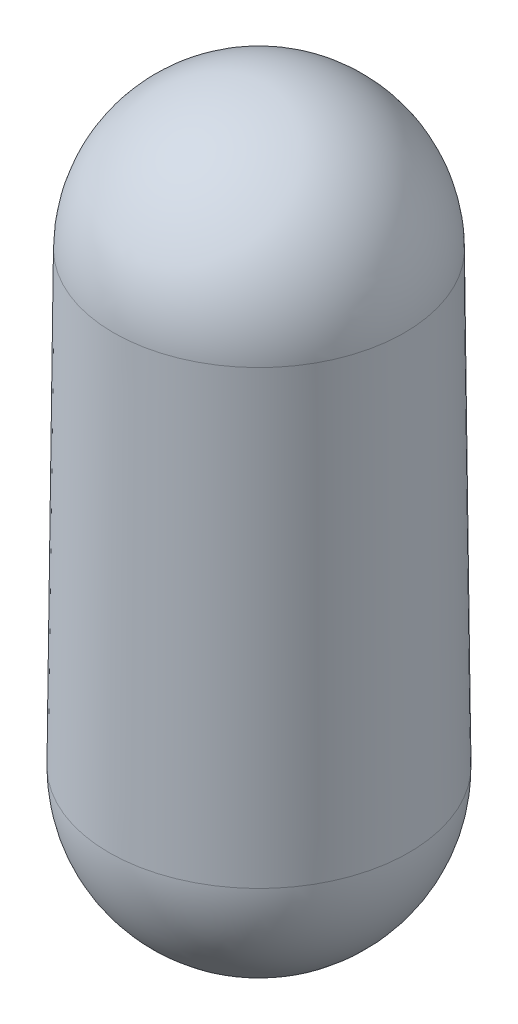
ISO-10303-21;
HEADER;
FILE_DESCRIPTION(('STEP AP214'),'2;1');
FILE_NAME('part.step','',(''),(''),'','','');
FILE_SCHEMA(('AUTOMOTIVE_DESIGN { 1 0 10303 214 1 1 1 1 }'));
ENDSEC;
DATA;
#1=APPLICATION_CONTEXT('core data for automotive mechanical design processes');
#2=APPLICATION_PROTOCOL_DEFINITION('international standard','automotive_design',2000,#1);
#3=PRODUCT_CONTEXT('',#1,'mechanical');
#4=PRODUCT('Part','Part','',(#3));
#5=PRODUCT_RELATED_PRODUCT_CATEGORY('part','',(#4));
#6=PRODUCT_DEFINITION_FORMATION('','',#4);
#7=PRODUCT_DEFINITION_CONTEXT('part definition',#1,'design');
#8=PRODUCT_DEFINITION('design','',#6,#7);
#9=PRODUCT_DEFINITION_SHAPE('','',#8);
#10=(LENGTH_UNIT() NAMED_UNIT(*) SI_UNIT(.MILLI.,.METRE.));
#11=(NAMED_UNIT(*) PLANE_ANGLE_UNIT() SI_UNIT($,.RADIAN.));
#12=(NAMED_UNIT(*) SI_UNIT($,.STERADIAN.) SOLID_ANGLE_UNIT());
#13=UNCERTAINTY_MEASURE_WITH_UNIT(LENGTH_MEASURE(1.E-05),#10,'distance_accuracy_value','');
#14=(GEOMETRIC_REPRESENTATION_CONTEXT(3) GLOBAL_UNCERTAINTY_ASSIGNED_CONTEXT((#13)) GLOBAL_UNIT_ASSIGNED_CONTEXT((#10,
#11,#12)) REPRESENTATION_CONTEXT('',''));
#15=CARTESIAN_POINT('',(0.,0.,0.));
#16=DIRECTION('',(0.,0.,1.));
#17=DIRECTION('',(1.,0.,0.));
#18=AXIS2_PLACEMENT_3D('',#15,#16,#17);
#19=CARTESIAN_POINT('',(0.,-2492.17747502716,0.));
#20=DIRECTION('',(0.,1.,0.));
#21=DIRECTION('',(1.,0.,0.));
#22=AXIS2_PLACEMENT_3D('',#19,#20,#21);
#23=CYLINDRICAL_SURFACE('',#22,38.989);
#24=CARTESIAN_POINT('',(0.,-2461.95147502716,0.));
#25=DIRECTION('',(0.,1.,0.));
#26=DIRECTION('',(1.,0.,0.));
#27=AXIS2_PLACEMENT_3D('',#24,#25,#26);
#28=CIRCLE('',#27,38.989);
#29=CARTESIAN_POINT('',(38.989,-2461.95147502716,0.));
#30=VERTEX_POINT('',#29);
#31=EDGE_CURVE('E164',#30,#30,#28,.T.);
#32=ORIENTED_EDGE('',*,*,#31,.T.);
#33=EDGE_LOOP('',(#32));
#34=FACE_BOUND('',#33,.T.);
#35=CARTESIAN_POINT('',(0.,-2471.60347502716,0.));
#36=DIRECTION('',(0.,-1.,0.));
#37=DIRECTION('',(-1.,0.,0.));
#38=AXIS2_PLACEMENT_3D('',#35,#36,#37);
#39=CIRCLE('',#38,38.989);
#40=CARTESIAN_POINT('',(-38.989,-2471.60347502716,0.));
#41=VERTEX_POINT('',#40);
#42=EDGE_CURVE('E51',#41,#41,#39,.F.);
#43=ORIENTED_EDGE('',*,*,#42,.F.);
#44=EDGE_LOOP('',(#43));
#45=FACE_BOUND('',#44,.T.);
#46=ADVANCED_FACE('F47',(#34,#45),#23,.F.);
#47=CARTESIAN_POINT('',(0.,-2492.17747502716,0.));
#48=DIRECTION('',(0.,1.,0.));
#49=DIRECTION('',(1.,0.,0.));
#50=AXIS2_PLACEMENT_3D('',#47,#48,#49);
#51=CYLINDRICAL_SURFACE('',#50,54.102);
#52=CARTESIAN_POINT('',(0.,-2463.53897502716,0.));
#53=DIRECTION('',(0.,1.,0.));
#54=DIRECTION('',(1.,0.,0.));
#55=AXIS2_PLACEMENT_3D('',#52,#53,#54);
#56=CIRCLE('',#55,54.102);
#57=CARTESIAN_POINT('',(54.102,-2463.53897502716,0.));
#58=VERTEX_POINT('',#57);
#59=EDGE_CURVE('E11',#58,#58,#56,.F.);
#60=ORIENTED_EDGE('',*,*,#59,.F.);
#61=EDGE_LOOP('',(#60));
#62=FACE_BOUND('',#61,.T.);
#63=CARTESIAN_POINT('',(0.,-2461.95147502716,0.));
#64=DIRECTION('',(0.,1.,0.));
#65=DIRECTION('',(1.,0.,0.));
#66=AXIS2_PLACEMENT_3D('',#63,#64,#65);
#67=CIRCLE('',#66,54.102);
#68=CARTESIAN_POINT('',(54.102,-2461.95147502716,0.));
#69=VERTEX_POINT('',#68);
#70=EDGE_CURVE('E60',#69,#69,#67,.T.);
#71=ORIENTED_EDGE('',*,*,#70,.F.);
#72=EDGE_LOOP('',(#71));
#73=FACE_BOUND('',#72,.T.);
#74=ADVANCED_FACE('F49',(#62,#73),#51,.T.);
#75=CARTESIAN_POINT('',(0.,-2461.95147502716,0.));
#76=DIRECTION('',(0.,1.,0.));
#77=DIRECTION('',(1.,0.,0.));
#78=AXIS2_PLACEMENT_3D('',#75,#76,#77);
#79=PLANE('',#78);
#80=ORIENTED_EDGE('',*,*,#31,.F.);
#81=EDGE_LOOP('',(#80));
#82=FACE_BOUND('',#81,.T.);
#83=ORIENTED_EDGE('',*,*,#70,.T.);
#84=EDGE_LOOP('',(#83));
#85=FACE_BOUND('',#84,.T.);
#86=ADVANCED_FACE('F105',(#82,#85),#79,.T.);
#87=CARTESIAN_POINT('',(0.,-2755.23515865923,0.));
#88=DIRECTION('',(0.,1.,0.));
#89=DIRECTION('',(1.,0.,0.));
#90=AXIS2_PLACEMENT_3D('',#87,#88,#89);
#91=CYLINDRICAL_SURFACE('',#90,95.25);
#92=CARTESIAN_POINT('',(0.,-2485.82747502716,0.));
#93=DIRECTION('',(0.,1.,0.));
#94=DIRECTION('',(1.,0.,0.));
#95=AXIS2_PLACEMENT_3D('',#92,#93,#94);
#96=CIRCLE('',#95,95.25);
#97=CARTESIAN_POINT('',(95.25,-2485.82747502716,0.));
#98=VERTEX_POINT('',#97);
#99=EDGE_CURVE('E72',#98,#98,#96,.F.);
#100=ORIENTED_EDGE('',*,*,#99,.F.);
#101=EDGE_LOOP('',(#100));
#102=FACE_BOUND('',#101,.T.);
#103=CARTESIAN_POINT('',(0.,-2463.53897502716,0.));
#104=DIRECTION('',(0.,1.,0.));
#105=DIRECTION('',(1.,0.,0.));
#106=AXIS2_PLACEMENT_3D('',#103,#104,#105);
#107=CIRCLE('',#106,95.25);
#108=CARTESIAN_POINT('',(95.25,-2463.53897502716,0.));
#109=VERTEX_POINT('',#108);
#110=EDGE_CURVE('E67',#109,#109,#107,.T.);
#111=ORIENTED_EDGE('',*,*,#110,.F.);
#112=EDGE_LOOP('',(#111));
#113=FACE_BOUND('',#112,.T.);
#114=ADVANCED_FACE('F102',(#102,#113),#91,.T.);
#115=CARTESIAN_POINT('',(0.,-2463.53897502716,0.));
#116=DIRECTION('',(0.,1.,0.));
#117=DIRECTION('',(1.,0.,0.));
#118=AXIS2_PLACEMENT_3D('',#115,#116,#117);
#119=PLANE('',#118);
#120=CARTESIAN_POINT('',(53.8815367264154,-2463.53897502716,53.8815367264145));
#121=DIRECTION('',(0.,1.,0.));
#122=DIRECTION('',(0.,0.,1.));
#123=AXIS2_PLACEMENT_3D('',#120,#121,#122);
#124=CIRCLE('',#123,9.52499999999999);
#125=CARTESIAN_POINT('',(53.8815367264155,-2463.53897502716,63.4065367264145));
#126=VERTEX_POINT('',#125);
#127=EDGE_CURVE('E165',#126,#126,#124,.T.);
#128=ORIENTED_EDGE('',*,*,#127,.F.);
#129=EDGE_LOOP('',(#128));
#130=FACE_BOUND('',#129,.T.);
#131=CARTESIAN_POINT('',(-53.8815367264146,-2463.53897502716,53.8815367264152));
#132=DIRECTION('',(0.,1.,0.));
#133=DIRECTION('',(-1.,0.,0.));
#134=AXIS2_PLACEMENT_3D('',#131,#132,#133);
#135=CIRCLE('',#134,9.52499999999999);
#136=CARTESIAN_POINT('',(-63.4065367264146,-2463.53897502716,53.8815367264152));
#137=VERTEX_POINT('',#136);
#138=EDGE_CURVE('E178',#137,#137,#135,.T.);
#139=ORIENTED_EDGE('',*,*,#138,.F.);
#140=EDGE_LOOP('',(#139));
#141=FACE_BOUND('',#140,.T.);
#142=CARTESIAN_POINT('',(-53.881536726415,-2463.53897502716,-53.8815367264147));
#143=DIRECTION('',(0.,1.,0.));
#144=DIRECTION('',(0.,0.,-1.));
#145=AXIS2_PLACEMENT_3D('',#142,#143,#144);
#146=CIRCLE('',#145,9.52499999999999);
#147=CARTESIAN_POINT('',(-53.8815367264151,-2463.53897502716,-63.4065367264147));
#148=VERTEX_POINT('',#147);
#149=EDGE_CURVE('E80',#148,#148,#146,.T.);
#150=ORIENTED_EDGE('',*,*,#149,.F.);
#151=EDGE_LOOP('',(#150));
#152=FACE_BOUND('',#151,.T.);
#153=CARTESIAN_POINT('',(53.881536726415,-2463.53897502716,-53.8815367264149));
#154=DIRECTION('',(0.,1.,0.));
#155=DIRECTION('',(1.,0.,0.));
#156=AXIS2_PLACEMENT_3D('',#153,#154,#155);
#157=CIRCLE('',#156,9.52499999999999);
#158=CARTESIAN_POINT('',(63.406536726415,-2463.53897502716,-53.8815367264149));
#159=VERTEX_POINT('',#158);
#160=EDGE_CURVE('E68',#159,#159,#157,.T.);
#161=ORIENTED_EDGE('',*,*,#160,.F.);
#162=EDGE_LOOP('',(#161));
#163=FACE_BOUND('',#162,.T.);
#164=ORIENTED_EDGE('',*,*,#59,.T.);
#165=EDGE_LOOP('',(#164));
#166=FACE_BOUND('',#165,.T.);
#167=ORIENTED_EDGE('',*,*,#110,.T.);
#168=EDGE_LOOP('',(#167));
#169=FACE_BOUND('',#168,.T.);
#170=ADVANCED_FACE('F97',(#130,#141,#152,#163,#166,#169),#119,.T.);
#171=CARTESIAN_POINT('',(0.,-2485.82747502716,0.));
#172=DIRECTION('',(0.,1.,0.));
#173=DIRECTION('',(1.,0.,0.));
#174=AXIS2_PLACEMENT_3D('',#171,#172,#173);
#175=PLANE('',#174);
#176=CARTESIAN_POINT('',(53.8815367264154,-2485.82747502716,53.8815367264145));
#177=DIRECTION('',(0.,1.,0.));
#178=DIRECTION('',(0.,0.,1.));
#179=AXIS2_PLACEMENT_3D('',#176,#177,#178);
#180=CIRCLE('',#179,9.52499999999999);
#181=CARTESIAN_POINT('',(53.8815367264155,-2485.82747502716,63.4065367264145));
#182=VERTEX_POINT('',#181);
#183=EDGE_CURVE('E168',#182,#182,#180,.T.);
#184=ORIENTED_EDGE('',*,*,#183,.T.);
#185=EDGE_LOOP('',(#184));
#186=FACE_BOUND('',#185,.T.);
#187=CARTESIAN_POINT('',(-53.8815367264146,-2485.82747502716,53.8815367264152));
#188=DIRECTION('',(0.,1.,0.));
#189=DIRECTION('',(-1.,0.,0.));
#190=AXIS2_PLACEMENT_3D('',#187,#188,#189);
#191=CIRCLE('',#190,9.52499999999999);
#192=CARTESIAN_POINT('',(-63.4065367264146,-2485.82747502716,53.8815367264152));
#193=VERTEX_POINT('',#192);
#194=EDGE_CURVE('E181',#193,#193,#191,.T.);
#195=ORIENTED_EDGE('',*,*,#194,.T.);
#196=EDGE_LOOP('',(#195));
#197=FACE_BOUND('',#196,.T.);
#198=CARTESIAN_POINT('',(-53.881536726415,-2485.82747502716,-53.8815367264147));
#199=DIRECTION('',(0.,1.,0.));
#200=DIRECTION('',(0.,0.,-1.));
#201=AXIS2_PLACEMENT_3D('',#198,#199,#200);
#202=CIRCLE('',#201,9.52499999999999);
#203=CARTESIAN_POINT('',(-53.8815367264151,-2485.82747502716,-63.4065367264147));
#204=VERTEX_POINT('',#203);
#205=EDGE_CURVE('E75',#204,#204,#202,.T.);
#206=ORIENTED_EDGE('',*,*,#205,.T.);
#207=EDGE_LOOP('',(#206));
#208=FACE_BOUND('',#207,.T.);
#209=CARTESIAN_POINT('',(53.881536726415,-2485.82747502716,-53.8815367264149));
#210=DIRECTION('',(0.,1.,0.));
#211=DIRECTION('',(1.,0.,0.));
#212=AXIS2_PLACEMENT_3D('',#209,#210,#211);
#213=CIRCLE('',#212,9.52499999999999);
#214=CARTESIAN_POINT('',(63.406536726415,-2485.82747502716,-53.8815367264149));
#215=VERTEX_POINT('',#214);
#216=EDGE_CURVE('E65',#215,#215,#213,.T.);
#217=ORIENTED_EDGE('',*,*,#216,.T.);
#218=EDGE_LOOP('',(#217));
#219=FACE_BOUND('',#218,.T.);
#220=CARTESIAN_POINT('',(0.,-2485.82747502716,0.));
#221=DIRECTION('',(0.,1.,0.));
#222=DIRECTION('',(1.,0.,0.));
#223=AXIS2_PLACEMENT_3D('',#220,#221,#222);
#224=CIRCLE('',#223,54.102);
#225=CARTESIAN_POINT('',(54.102,-2485.82747502716,0.));
#226=VERTEX_POINT('',#225);
#227=EDGE_CURVE('E63',#226,#226,#224,.F.);
#228=ORIENTED_EDGE('',*,*,#227,.F.);
#229=EDGE_LOOP('',(#228));
#230=FACE_BOUND('',#229,.T.);
#231=ORIENTED_EDGE('',*,*,#99,.T.);
#232=EDGE_LOOP('',(#231));
#233=FACE_BOUND('',#232,.T.);
#234=ADVANCED_FACE('F93',(#186,#197,#208,#219,#230,#233),#175,.F.);
#235=CARTESIAN_POINT('',(0.,-2492.17747502716,0.));
#236=DIRECTION('',(0.,1.,0.));
#237=DIRECTION('',(1.,0.,0.));
#238=AXIS2_PLACEMENT_3D('',#235,#236,#237);
#239=PLANE('',#238);
#240=CARTESIAN_POINT('',(0.,-2492.17747502716,0.));
#241=DIRECTION('',(0.,-1.,0.));
#242=DIRECTION('',(-1.,0.,0.));
#243=AXIS2_PLACEMENT_3D('',#240,#241,#242);
#244=CIRCLE('',#243,45.339);
#245=CARTESIAN_POINT('',(-45.339,-2492.17747502716,0.));
#246=VERTEX_POINT('',#245);
#247=EDGE_CURVE('E173',#246,#246,#244,.T.);
#248=ORIENTED_EDGE('',*,*,#247,.F.);
#249=EDGE_LOOP('',(#248));
#250=FACE_BOUND('',#249,.T.);
#251=CARTESIAN_POINT('',(0.,-2492.17747502716,0.));
#252=DIRECTION('',(0.,1.,0.));
#253=DIRECTION('',(1.,0.,0.));
#254=AXIS2_PLACEMENT_3D('',#251,#252,#253);
#255=CIRCLE('',#254,54.102);
#256=CARTESIAN_POINT('',(54.102,-2492.17747502716,0.));
#257=VERTEX_POINT('',#256);
#258=EDGE_CURVE('E55',#257,#257,#255,.T.);
#259=ORIENTED_EDGE('',*,*,#258,.F.);
#260=EDGE_LOOP('',(#259));
#261=FACE_BOUND('',#260,.T.);
#262=ADVANCED_FACE('F96',(#250,#261),#239,.F.);
#263=ORIENTED_EDGE('',*,*,#258,.T.);
#264=EDGE_LOOP('',(#263));
#265=FACE_BOUND('',#264,.T.);
#266=ORIENTED_EDGE('',*,*,#227,.T.);
#267=EDGE_LOOP('',(#266));
#268=FACE_BOUND('',#267,.T.);
#269=ADVANCED_FACE('F91',(#265,#268),#51,.T.);
#270=CARTESIAN_POINT('',(53.881536726415,-2492.17747502716,-53.8815367264149));
#271=DIRECTION('',(0.,1.,0.));
#272=DIRECTION('',(1.,0.,0.));
#273=AXIS2_PLACEMENT_3D('',#270,#271,#272);
#274=CYLINDRICAL_SURFACE('',#273,9.52499999999999);
#275=ORIENTED_EDGE('',*,*,#160,.T.);
#276=EDGE_LOOP('',(#275));
#277=FACE_BOUND('',#276,.T.);
#278=ORIENTED_EDGE('',*,*,#216,.F.);
#279=EDGE_LOOP('',(#278));
#280=FACE_BOUND('',#279,.T.);
#281=ADVANCED_FACE('F141',(#277,#280),#274,.F.);
#282=CARTESIAN_POINT('',(-53.881536726415,-2492.17747502716,-53.8815367264147));
#283=DIRECTION('',(0.,1.,0.));
#284=DIRECTION('',(0.,0.,-1.));
#285=AXIS2_PLACEMENT_3D('',#282,#283,#284);
#286=CYLINDRICAL_SURFACE('',#285,9.52499999999999);
#287=ORIENTED_EDGE('',*,*,#149,.T.);
#288=EDGE_LOOP('',(#287));
#289=FACE_BOUND('',#288,.T.);
#290=ORIENTED_EDGE('',*,*,#205,.F.);
#291=EDGE_LOOP('',(#290));
#292=FACE_BOUND('',#291,.T.);
#293=ADVANCED_FACE('F137',(#289,#292),#286,.F.);
#294=CARTESIAN_POINT('',(-53.8815367264146,-2492.17747502716,53.8815367264152));
#295=DIRECTION('',(0.,1.,0.));
#296=DIRECTION('',(-1.,0.,0.));
#297=AXIS2_PLACEMENT_3D('',#294,#295,#296);
#298=CYLINDRICAL_SURFACE('',#297,9.52499999999999);
#299=ORIENTED_EDGE('',*,*,#138,.T.);
#300=EDGE_LOOP('',(#299));
#301=FACE_BOUND('',#300,.T.);
#302=ORIENTED_EDGE('',*,*,#194,.F.);
#303=EDGE_LOOP('',(#302));
#304=FACE_BOUND('',#303,.T.);
#305=ADVANCED_FACE('F133',(#301,#304),#298,.F.);
#306=CARTESIAN_POINT('',(53.8815367264154,-2492.17747502716,53.8815367264145));
#307=DIRECTION('',(0.,1.,0.));
#308=DIRECTION('',(0.,0.,1.));
#309=AXIS2_PLACEMENT_3D('',#306,#307,#308);
#310=CYLINDRICAL_SURFACE('',#309,9.52499999999999);
#311=ORIENTED_EDGE('',*,*,#127,.T.);
#312=EDGE_LOOP('',(#311));
#313=FACE_BOUND('',#312,.T.);
#314=ORIENTED_EDGE('',*,*,#183,.F.);
#315=EDGE_LOOP('',(#314));
#316=FACE_BOUND('',#315,.T.);
#317=ADVANCED_FACE('F129',(#313,#316),#310,.F.);
#318=CARTESIAN_POINT('',(0.,-2471.60347502716,0.));
#319=DIRECTION('',(0.,-1.,0.));
#320=DIRECTION('',(-1.,0.,0.));
#321=AXIS2_PLACEMENT_3D('',#318,#319,#320);
#322=PLANE('',#321);
#323=CARTESIAN_POINT('',(0.,-2471.60347502716,0.));
#324=DIRECTION('',(0.,-1.,0.));
#325=DIRECTION('',(-1.,0.,0.));
#326=AXIS2_PLACEMENT_3D('',#323,#324,#325);
#327=CIRCLE('',#326,45.339);
#328=CARTESIAN_POINT('',(-45.339,-2471.60347502716,0.));
#329=VERTEX_POINT('',#328);
#330=EDGE_CURVE('E171',#329,#329,#327,.T.);
#331=ORIENTED_EDGE('',*,*,#330,.T.);
#332=EDGE_LOOP('',(#331));
#333=FACE_BOUND('',#332,.T.);
#334=ORIENTED_EDGE('',*,*,#42,.T.);
#335=EDGE_LOOP('',(#334));
#336=FACE_BOUND('',#335,.T.);
#337=ADVANCED_FACE('F132',(#333,#336),#322,.T.);
#338=CARTESIAN_POINT('',(0.,-2471.60347502716,0.));
#339=DIRECTION('',(0.,-1.,0.));
#340=DIRECTION('',(-1.,0.,0.));
#341=AXIS2_PLACEMENT_3D('',#338,#339,#340);
#342=CYLINDRICAL_SURFACE('',#341,45.339);
#343=ORIENTED_EDGE('',*,*,#330,.F.);
#344=EDGE_LOOP('',(#343));
#345=FACE_BOUND('',#344,.T.);
#346=ORIENTED_EDGE('',*,*,#247,.T.);
#347=EDGE_LOOP('',(#346));
#348=FACE_BOUND('',#347,.T.);
#349=ADVANCED_FACE('F127',(#345,#348),#342,.F.);
#350=CLOSED_SHELL('',(#46,#74,#86,#114,#170,#234,#262,#269,#281,#293,#305,#317,#337,#349));
#351=MANIFOLD_SOLID_BREP('B2',#350);
#352=CARTESIAN_POINT('',(0.,-484.974379996435,4.98505236413368));
#353=DIRECTION('',(-1.,0.,0.));
#354=DIRECTION('',(0.,0.,1.));
#355=AXIS2_PLACEMENT_3D('',#352,#353,#354);
#356=CIRCLE('',#355,482.84);
#357=TRIMMED_CURVE('',#356,(PARAMETER_VALUE(-1.58112094971595)),
(PARAMETER_VALUE(1.58112094971595)),.T.,.PARAMETER.);
#358=CARTESIAN_POINT('',(0.,-484.974379996435,0.));
#359=DIRECTION('',(0.,1.,0.));
#360=AXIS1_PLACEMENT('',#358,#359);
#361=SURFACE_OF_REVOLUTION('',#357,#360);
#362=CARTESIAN_POINT('',(0.,-480.011529102625,0.));
#363=DIRECTION('',(0.,1.,0.));
#364=DIRECTION('',(0.,0.,1.));
#365=AXIS2_PLACEMENT_3D('',#362,#363,#364);
#366=CIRCLE('',#365,487.799546462028);
#367=CARTESIAN_POINT('',(0.,-480.011529102625,487.799546462028));
#368=VERTEX_POINT('',#367);
#369=EDGE_CURVE('E290',#368,#368,#366,.T.);
#370=ORIENTED_EDGE('',*,*,#369,.F.);
#371=EDGE_LOOP('',(#370));
#372=FACE_BOUND('',#371,.T.);
#373=CARTESIAN_POINT('',(0.,-2.16011461799104,0.));
#374=VERTEX_POINT('',#373);
#375=VERTEX_LOOP('',#374);
#376=FACE_BOUND('',#375,.T.);
#377=ADVANCED_FACE('F281',(#372,#376),#361,.F.);
#378=CARTESIAN_POINT('',(0.,-480.011529102625,0.));
#379=DIRECTION('',(0.,-1.,0.));
#380=DIRECTION('',(0.,0.,-1.));
#381=AXIS2_PLACEMENT_3D('',#378,#379,#380);
#382=CONICAL_SURFACE('',#381,487.799546462028,0.0102786394722393);
#383=CARTESIAN_POINT('',(0.,-1989.41922446168,0.));
#384=DIRECTION('',(0.,1.,0.));
#385=DIRECTION('',(0.,0.,1.));
#386=AXIS2_PLACEMENT_3D('',#383,#384,#385);
#387=CIRCLE('',#386,503.314750379081);
#388=CARTESIAN_POINT('',(-503.314750378499,-1989.41922446168,0.));
#389=VERTEX_POINT('',#388);
#390=EDGE_CURVE('E45',#389,#389,#387,.T.);
#391=ORIENTED_EDGE('',*,*,#390,.F.);
#392=EDGE_LOOP('',(#391));
#393=FACE_BOUND('',#392,.T.);
#394=ORIENTED_EDGE('',*,*,#369,.T.);
#395=EDGE_LOOP('',(#394));
#396=FACE_BOUND('',#395,.T.);
#397=ADVANCED_FACE('F315',(#393,#396),#382,.F.);
#398=CARTESIAN_POINT('',(0.,-1989.40813526116,0.));
#399=DIRECTION('',(0.,1.,0.));
#400=DIRECTION('',(-1.,0.,0.));
#401=AXIS2_PLACEMENT_3D('',#398,#399,#400);
#402=SPHERICAL_SURFACE('',#401,503.31475050066);
#403=CARTESIAN_POINT('',(0.,-2483.62789970967,0.));
#404=DIRECTION('',(0.,1.,0.));
#405=DIRECTION('',(0.,0.,1.));
#406=AXIS2_PLACEMENT_3D('',#403,#404,#405);
#407=CIRCLE('',#406,95.25);
#408=CARTESIAN_POINT('',(-95.2499999999976,-2483.62789970967,0.));
#409=VERTEX_POINT('',#408);
#410=EDGE_CURVE('E285',#409,#409,#407,.F.);
#411=CARTESIAN_POINT('',(-95.2499999999976,-2483.62789970967,0.));
#412=CARTESIAN_POINT('',(-98.8031858544357,-2482.94310784886,0.));
#413=CARTESIAN_POINT('',(-102.348984029362,-2482.2199851255,0.));
#414=CARTESIAN_POINT('',(-109.424161609695,-2480.69744232751,0.));
#415=CARTESIAN_POINT('',(-112.953541015101,-2479.89802225288,0.));
#416=CARTESIAN_POINT('',(-119.994237645894,-2478.22324912621,0.));
#417=CARTESIAN_POINT('',(-123.505554871282,-2477.34789607415,0.));
#418=CARTESIAN_POINT('',(-130.508494180215,-2475.521666199,0.));
#419=CARTESIAN_POINT('',(-134.00011626376,-2474.5707893759,0.));
#420=CARTESIAN_POINT('',(-140.962040940609,-2472.59395374897,0.));
#421=CARTESIAN_POINT('',(-144.432343533913,-2471.56799494514,0.));
#422=CARTESIAN_POINT('',(-151.35001494621,-2469.44147275648,0.));
#423=CARTESIAN_POINT('',(-154.797383765205,-2468.34090937165,0.));
#424=CARTESIAN_POINT('',(-161.667583973776,-2466.06568994233,0.));
#425=CARTESIAN_POINT('',(-165.090415363354,-2464.89103389784,0.));
#426=CARTESIAN_POINT('',(-171.909948482855,-2462.46817558597,0.));
#427=CARTESIAN_POINT('',(-175.306650212778,-2461.2199733186,0.));
#428=CARTESIAN_POINT('',(-182.0723439349,-2458.65060319683,0.));
#429=CARTESIAN_POINT('',(-185.441335927098,-2457.32943534244,0.));
#430=CARTESIAN_POINT('',(-192.150042986468,-2454.61474862815,0.));
#431=CARTESIAN_POINT('',(-195.48975805364,-2453.22122976826,0.));
#432=CARTESIAN_POINT('',(-202.138357694494,-2450.36248927978,0.));
#433=CARTESIAN_POINT('',(-205.447242268176,-2448.89726765119,0.));
#434=CARTESIAN_POINT('',(-212.032641695366,-2445.89580321706,0.));
#435=CARTESIAN_POINT('',(-215.309156548873,-2444.35956041152,0.));
#436=CARTESIAN_POINT('',(-221.82829236676,-2441.21676825281,0.));
#437=CARTESIAN_POINT('',(-225.070913331139,-2439.61021889963,0.));
#438=CARTESIAN_POINT('',(-231.520752968575,-2436.32756098016,0.));
#439=CARTESIAN_POINT('',(-234.727971641632,-2434.65145241386,0.));
#440=CARTESIAN_POINT('',(-241.105514762666,-2431.23045576021,0.));
#441=CARTESIAN_POINT('',(-244.275839210642,-2429.48556767286,0.));
#442=CARTESIAN_POINT('',(-250.578119110208,-2425.92782366401,0.));
#443=CARTESIAN_POINT('',(-253.710074561798,-2424.11496774252,0.));
#444=CARTESIAN_POINT('',(-259.934159545773,-2420.4221313696,0.));
#445=CARTESIAN_POINT('',(-263.026289078158,-2418.54215091817,0.));
#446=CARTESIAN_POINT('',(-269.169283827123,-2414.71594001453,0.));
#447=CARTESIAN_POINT('',(-272.220149043702,-2412.76970956232,0.));
#448=CARTESIAN_POINT('',(-278.279195959787,-2408.81190400449,0.));
#449=CARTESIAN_POINT('',(-281.287377659293,-2406.80032889886,0.));
#450=CARTESIAN_POINT('',(-287.259658195476,-2402.71276977855,0.));
#451=CARTESIAN_POINT('',(-290.223757032154,-2400.63678576386,0.));
#452=CARTESIAN_POINT('',(-296.106493003393,-2396.42137453154,0.));
#453=CARTESIAN_POINT('',(-299.025130137954,-2394.2819473139,0.));
#454=CARTESIAN_POINT('',(-304.815585013539,-2389.94064489426,0.));
#455=CARTESIAN_POINT('',(-307.687402754563,-2387.73876969226,0.));
#456=CARTESIAN_POINT('',(-313.382882931099,-2383.27359557207,0.));
#457=CARTESIAN_POINT('',(-316.20654536661,-2381.01029665388,0.));
#458=CARTESIAN_POINT('',(-321.804401421025,-2376.42332794252,0.));
#459=CARTESIAN_POINT('',(-324.578595039929,-2374.09965814936,0.));
#460=CARTESIAN_POINT('',(-330.076222961934,-2369.39302861262,0.));
#461=CARTESIAN_POINT('',(-332.799657265036,-2367.01006886904,0.));
#462=CARTESIAN_POINT('',(-338.194499668458,-2362.18596793652,0.));
#463=CARTESIAN_POINT('',(-340.865907768778,-2359.74482674757,0.));
#464=CARTESIAN_POINT('',(-346.155455081204,-2354.8054984942,0.));
#465=CARTESIAN_POINT('',(-348.77359429331,-2352.30731142978,0.));
#466=CARTESIAN_POINT('',(-353.955385923489,-2347.25505353193,0.));
#467=CARTESIAN_POINT('',(-356.519038341563,-2344.70098269851,0.));
#468=CARTESIAN_POINT('',(-361.590663824027,-2339.53814536517,0.));
#469=CARTESIAN_POINT('',(-364.098636888417,-2336.92937886525,0.));
#470=CARTESIAN_POINT('',(-369.057737004777,-2331.65836374472,0.));
#471=CARTESIAN_POINT('',(-371.508864056747,-2328.99611512411,0.));
#472=CARTESIAN_POINT('',(-376.353131933157,-2323.61937418684,0.));
#473=CARTESIAN_POINT('',(-378.746272757596,-2320.90488187018,0.));
#474=CARTESIAN_POINT('',(-383.473454937862,-2315.42491626814,0.));
#475=CARTESIAN_POINT('',(-385.807496293689,-2312.65944298277,0.));
#476=CARTESIAN_POINT('',(-390.415393787535,-2307.07880188598,0.));
#477=CARTESIAN_POINT('',(-392.689249925554,-2304.26363407457,0.));
#478=CARTESIAN_POINT('',(-397.175719231545,-2298.58491348527,0.));
#479=CARTESIAN_POINT('',(-399.388332399516,-2295.72136070738,0.));
#480=CARTESIAN_POINT('',(-403.751286502172,-2289.94720225242,0.));
#481=CARTESIAN_POINT('',(-405.901627436857,-2287.03659657534,0.));
#482=CARTESIAN_POINT('',(-410.139036777494,-2281.16968627733,0.));
#483=CARTESIAN_POINT('',(-412.226105183445,-2278.21338165641,0.));
#484=CARTESIAN_POINT('',(-416.335998604281,-2272.25644868429,0.));
#485=CARTESIAN_POINT('',(-418.358823619164,-2269.2558203331,0.));
#486=CARTESIAN_POINT('',(-422.339289280263,-2263.21163573253,0.));
#487=CARTESIAN_POINT('',(-424.296929926479,-2260.16807948316,0.));
#488=CARTESIAN_POINT('',(-428.146116195103,-2254.03945488751,0.));
#489=CARTESIAN_POINT('',(-430.037661817512,-2250.95438654124,0.));
#490=CARTESIAN_POINT('',(-433.753778129461,-2244.74417286367,0.));
#491=CARTESIAN_POINT('',(-435.578348819001,-2241.61902753238,0.));
#492=CARTESIAN_POINT('',(-439.159666511549,-2235.33011363967,0.));
#493=CARTESIAN_POINT('',(-440.916413514555,-2232.16634507824,0.));
#494=CARTESIAN_POINT('',(-444.361266630586,-2225.8016564469,0.));
#495=CARTESIAN_POINT('',(-446.04937274361,-2222.60073637699,0.));
#496=CARTESIAN_POINT('',(-449.356158806592,-2216.16323373244,0.));
#497=CARTESIAN_POINT('',(-450.97483875655,-2212.9266511578,0.));
#498=CARTESIAN_POINT('',(-454.142019515972,-2206.41932909707,0.));
#499=CARTESIAN_POINT('',(-455.690520325437,-2203.14858961098,0.));
#500=CARTESIAN_POINT('',(-458.716622472376,-2196.57447520969,0.));
#501=CARTESIAN_POINT('',(-460.19422380985,-2193.2711002945,0.));
#502=CARTESIAN_POINT('',(-463.077839662319,-2186.63325169873,0.));
#503=CARTESIAN_POINT('',(-464.483854177315,-2183.29877801816,0.));
#504=CARTESIAN_POINT('',(-467.223642335093,-2176.60028302186,0.));
#505=CARTESIAN_POINT('',(-468.557415977876,-2173.23626170613,0.));
#506=CARTESIAN_POINT('',(-471.152101946499,-2166.48023631474,0.));
#507=CARTESIAN_POINT('',(-472.41301427234,-2163.08823223907,0.));
#508=CARTESIAN_POINT('',(-474.86139105597,-2156.27781922,0.));
#509=CARTESIAN_POINT('',(-476.048855513759,-2152.8594102766,0.));
#510=CARTESIAN_POINT('',(-478.349784176655,-2145.99777769731,0.));
#511=CARTESIAN_POINT('',(-479.463248381761,-2142.55455406142,0.));
#512=CARTESIAN_POINT('',(-481.615658578087,-2135.64489381567,0.));
#513=CARTESIAN_POINT('',(-482.654604569307,-2132.17845720581,0.));
#514=CARTESIAN_POINT('',(-484.657495041038,-2125.22398352888,0.));
#515=CARTESIAN_POINT('',(-485.62143952155,-2121.7359464618,0.));
#516=CARTESIAN_POINT('',(-487.473878564235,-2114.73989443526,0.));
#517=CARTESIAN_POINT('',(-488.362373126408,-2111.2318794758,0.));
#518=CARTESIAN_POINT('',(-490.063499022592,-2104.19750352264,0.));
#519=CARTESIAN_POINT('',(-490.876130356603,-2100.67114252895,0.));
#520=CARTESIAN_POINT('',(-492.42515177662,-2093.6017148997,0.));
#521=CARTESIAN_POINT('',(-493.161541862626,-2090.05864826415,0.));
#522=CARTESIAN_POINT('',(-494.55773823295,-2082.95745751465,0.));
#523=CARTESIAN_POINT('',(-495.217544517267,-2079.39933340072,0.));
#524=CARTESIAN_POINT('',(-496.46026635481,-2072.26968286239,0.));
#525=CARTESIAN_POINT('',(-497.043181908036,-2068.698156438,0.));
#526=CARTESIAN_POINT('',(-498.131851125618,-2061.54336268122,0.));
#527=CARTESIAN_POINT('',(-498.637604789975,-2057.96009534884,0.));
#528=CARTESIAN_POINT('',(-499.571714952771,-2050.7834866399,0.));
#529=CARTESIAN_POINT('',(-500.00007145121,-2047.19014526335,0.));
#530=CARTESIAN_POINT('',(-500.779188058863,-2039.99506001722,0.));
#531=CARTESIAN_POINT('',(-501.129948168077,-2036.39331614764,0.));
#532=CARTESIAN_POINT('',(-501.753708683156,-2029.18310137124,0.));
#533=CARTESIAN_POINT('',(-502.026709089022,-2025.57463046441,0.));
#534=CARTESIAN_POINT('',(-502.494823753796,-2018.35264021365,0.));
#535=CARTESIAN_POINT('',(-502.689938012703,-2014.73912086971,0.));
#536=CARTESIAN_POINT('',(-503.002187565085,-2007.50871463702,0.));
#537=CARTESIAN_POINT('',(-503.119322858559,-2003.89182774827,0.));
#538=CARTESIAN_POINT('',(-503.275567661339,-1996.65636909477,0.));
#539=CARTESIAN_POINT('',(-503.314677170645,-1993.03779733002,0.));
#540=CARTESIAN_POINT('',(-503.314750378499,-1989.41922446168,0.));
#541=B_SPLINE_CURVE_WITH_KNOTS('',3,(#411,#412,#413,#414,#415,#416,#417,#418,#419,#420,#421,
#422,#423,#424,#425,#426,#427,#428,#429,#430,#431,#432,#433,#434,#435,#436,#437,#438,#439,#440,
#441,#442,#443,#444,#445,#446,#447,#448,#449,#450,#451,#452,#453,#454,#455,#456,#457,#458,#459,
#460,#461,#462,#463,#464,#465,#466,#467,#468,#469,#470,#471,#472,#473,#474,#475,#476,#477,#478,
#479,#480,#481,#482,#483,#484,#485,#486,#487,#488,#489,#490,#491,#492,#493,#494,#495,#496,#497,
#498,#499,#500,#501,#502,#503,#504,#505,#506,#507,#508,#509,#510,#511,#512,#513,#514,#515,#516,
#517,#518,#519,#520,#521,#522,#523,#524,#525,#526,#527,#528,#529,#530,#531,#532,#533,#534,#535,
#536,#537,#538,#539,#540),.UNSPECIFIED.,.F.,.F.,(4,2,2,2,2,2,2,2,2,2,2,2,2,2,2,2,2,2,2,2,2,2,2,
2,2,2,2,2,2,2,2,2,2,2,2,2,2,2,2,2,2,2,2,2,2,2,2,2,2,2,2,2,2,2,2,2,2,2,2,2,2,2,2,2,4),(0.,
10.8555077806047,21.7110155612095,32.5665233418142,43.422031122419,54.2775389030236,
65.1330466836284,75.9885544642332,86.844062244838,97.6995700254427,108.555077806048,
119.410585586652,130.266093367257,141.121601147862,151.977108928467,162.832616709071,
173.688124489676,184.543632270281,195.399140050886,206.25464783149,217.110155612095,
227.9656633927,238.821171173304,249.676678953909,260.532186734514,271.387694515119,
282.243202295724,293.098710076328,303.954217856933,314.809725637538,325.665233418143,
336.520741198747,347.376248979352,358.231756759957,369.087264540562,379.942772321166,
390.798280101771,401.653787882376,412.50929566298,423.364803443585,434.22031122419,
445.075819004795,455.9313267854,466.786834566004,477.642342346609,488.497850127214,
499.353357907819,510.208865688423,521.064373469028,531.919881249633,542.775389030238,
553.630896810842,564.486404591447,575.341912372052,586.197420152657,597.052927933261,
607.908435713866,618.763943494471,629.619451275076,640.474959055681,651.330466836285,
662.18597461689,673.041482397495,683.896990178099,694.752497958704),.UNSPECIFIED.);
#542=EDGE_CURVE('BSEAM283',#409,#389,#541,.T.);
#543=ORIENTED_EDGE('',*,*,#410,.T.);
#544=ORIENTED_EDGE('',*,*,#390,.T.);
#545=ORIENTED_EDGE('',*,*,#542,.T.);
#546=ORIENTED_EDGE('',*,*,#542,.F.);
#547=EDGE_LOOP('',(#543,#545,#544,#546));
#548=FACE_BOUND('',#547,.T.);
#549=ADVANCED_FACE('F283',(#548),#402,.F.);
#550=CARTESIAN_POINT('',(0.,-3040.01,0.));
#551=DIRECTION('',(0.,1.,0.));
#552=DIRECTION('',(0.,0.,1.));
#553=AXIS2_PLACEMENT_3D('',#550,#551,#552);
#554=CYLINDRICAL_SURFACE('',#553,95.25);
#555=CARTESIAN_POINT('',(0.,-2485.82747502716,0.));
#556=DIRECTION('',(0.,1.,0.));
#557=DIRECTION('',(0.,0.,1.));
#558=AXIS2_PLACEMENT_3D('',#555,#556,#557);
#559=CIRCLE('',#558,95.25);
#560=CARTESIAN_POINT('',(0.,-2485.82747502716,95.25));
#561=VERTEX_POINT('',#560);
#562=EDGE_CURVE('E331',#561,#561,#559,.F.);
#563=ORIENTED_EDGE('',*,*,#562,.T.);
#564=EDGE_LOOP('',(#563));
#565=FACE_BOUND('',#564,.T.);
#566=ORIENTED_EDGE('',*,*,#410,.F.);
#567=EDGE_LOOP('',(#566));
#568=FACE_BOUND('',#567,.T.);
#569=ADVANCED_FACE('F300',(#565,#568),#554,.F.);
#570=CARTESIAN_POINT('',(0.,-484.974379996435,4.98505236413368));
#571=DIRECTION('',(-1.,0.,0.));
#572=DIRECTION('',(0.,0.,1.));
#573=AXIS2_PLACEMENT_3D('',#570,#571,#572);
#574=CIRCLE('',#573,485.);
#575=TRIMMED_CURVE('',#574,(PARAMETER_VALUE(-1.58107496626714)),
(PARAMETER_VALUE(1.58107496626714)),.T.,.PARAMETER.);
#576=CARTESIAN_POINT('',(0.,-484.974379996435,0.));
#577=DIRECTION('',(0.,1.,0.));
#578=AXIS1_PLACEMENT('',#576,#577);
#579=SURFACE_OF_REVOLUTION('',#575,#578);
#580=CARTESIAN_POINT('',(0.,-479.989327632302,0.));
#581=DIRECTION('',(0.,1.,0.));
#582=DIRECTION('',(0.,0.,1.));
#583=AXIS2_PLACEMENT_3D('',#580,#581,#582);
#584=CIRCLE('',#583,489.959432360569);
#585=CARTESIAN_POINT('',(0.,-479.989327632302,489.959432360569));
#586=VERTEX_POINT('',#585);
#587=EDGE_CURVE('E325',#586,#586,#584,.T.);
#588=ORIENTED_EDGE('',*,*,#587,.T.);
#589=EDGE_LOOP('',(#588));
#590=FACE_BOUND('',#589,.T.);
#591=CARTESIAN_POINT('',(0.,0.,0.));
#592=VERTEX_POINT('',#591);
#593=VERTEX_LOOP('',#592);
#594=FACE_BOUND('',#593,.T.);
#595=ADVANCED_FACE('F297',(#590,#594),#579,.T.);
#596=CARTESIAN_POINT('',(0.,-479.989327632302,0.));
#597=DIRECTION('',(0.,-1.,0.));
#598=DIRECTION('',(0.,0.,-1.));
#599=AXIS2_PLACEMENT_3D('',#596,#597,#598);
#600=CONICAL_SURFACE('',#599,489.959432360569,0.0102786394722393);
#601=CARTESIAN_POINT('',(0.,-1989.40813526116,0.));
#602=DIRECTION('',(0.,1.,0.));
#603=DIRECTION('',(0.,0.,1.));
#604=AXIS2_PLACEMENT_3D('',#601,#602,#603);
#605=CIRCLE('',#604,505.47475050066);
#606=CARTESIAN_POINT('',(0.,-1989.40813526116,505.47475050066));
#607=VERTEX_POINT('',#606);
#608=EDGE_CURVE('E326',#607,#607,#605,.T.);
#609=ORIENTED_EDGE('',*,*,#608,.T.);
#610=EDGE_LOOP('',(#609));
#611=FACE_BOUND('',#610,.T.);
#612=ORIENTED_EDGE('',*,*,#587,.F.);
#613=EDGE_LOOP('',(#612));
#614=FACE_BOUND('',#613,.T.);
#615=ADVANCED_FACE('F299',(#611,#614),#600,.T.);
#616=CARTESIAN_POINT('',(0.,-1989.40813526116,0.));
#617=DIRECTION('',(0.,1.,0.));
#618=DIRECTION('',(-1.,0.,0.));
#619=AXIS2_PLACEMENT_3D('',#616,#617,#618);
#620=SPHERICAL_SURFACE('',#619,505.47475050066);
#621=ORIENTED_EDGE('',*,*,#562,.F.);
#622=EDGE_LOOP('',(#621));
#623=FACE_BOUND('',#622,.T.);
#624=ORIENTED_EDGE('',*,*,#608,.F.);
#625=EDGE_LOOP('',(#624));
#626=FACE_BOUND('',#625,.T.);
#627=ADVANCED_FACE('F306',(#623,#626),#620,.T.);
#628=CLOSED_SHELL('',(#377,#397,#549,#569,#595,#615,#627));
#629=MANIFOLD_SOLID_BREP('B6',#628);
#630=ADVANCED_BREP_SHAPE_REPRESENTATION('',(#18,#351,#629),#14);
#631=SHAPE_DEFINITION_REPRESENTATION(#9,#630);
ENDSEC;
END-ISO-10303-21;
